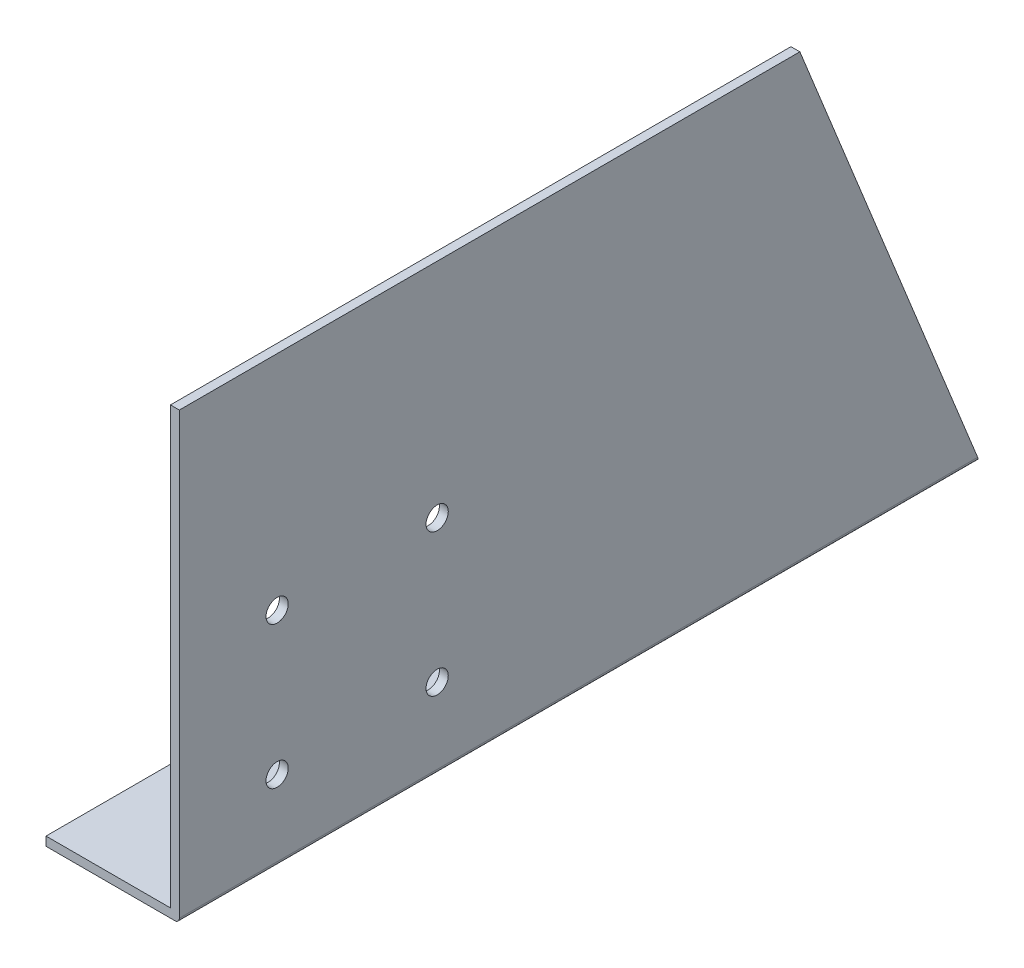
ISO-10303-21;
HEADER;
FILE_DESCRIPTION(('STEP AP214'),'2;1');
FILE_NAME('part.step','',(''),(''),'','','');
FILE_SCHEMA(('AUTOMOTIVE_DESIGN { 1 0 10303 214 1 1 1 1 }'));
ENDSEC;
DATA;
#1=APPLICATION_CONTEXT('core data for automotive mechanical design processes');
#2=APPLICATION_PROTOCOL_DEFINITION('international standard','automotive_design',2000,#1);
#3=PRODUCT_CONTEXT('',#1,'mechanical');
#4=PRODUCT('Part','Part','',(#3));
#5=PRODUCT_RELATED_PRODUCT_CATEGORY('part','',(#4));
#6=PRODUCT_DEFINITION_FORMATION('','',#4);
#7=PRODUCT_DEFINITION_CONTEXT('part definition',#1,'design');
#8=PRODUCT_DEFINITION('design','',#6,#7);
#9=PRODUCT_DEFINITION_SHAPE('','',#8);
#10=(LENGTH_UNIT() NAMED_UNIT(*) SI_UNIT(.MILLI.,.METRE.));
#11=(NAMED_UNIT(*) PLANE_ANGLE_UNIT() SI_UNIT($,.RADIAN.));
#12=(NAMED_UNIT(*) SI_UNIT($,.STERADIAN.) SOLID_ANGLE_UNIT());
#13=UNCERTAINTY_MEASURE_WITH_UNIT(LENGTH_MEASURE(1.E-05),#10,'distance_accuracy_value','');
#14=(GEOMETRIC_REPRESENTATION_CONTEXT(3) GLOBAL_UNCERTAINTY_ASSIGNED_CONTEXT((#13)) GLOBAL_UNIT_ASSIGNED_CONTEXT((#10,
#11,#12)) REPRESENTATION_CONTEXT('',''));
#15=CARTESIAN_POINT('',(0.,0.,0.));
#16=DIRECTION('',(0.,0.,1.));
#17=DIRECTION('',(1.,0.,0.));
#18=AXIS2_PLACEMENT_3D('',#15,#16,#17);
#19=CARTESIAN_POINT('',(0.,2.,180.));
#20=DIRECTION('',(1.,0.,0.));
#21=DIRECTION('',(0.,1.,0.));
#22=AXIS2_PLACEMENT_3D('',#19,#20,#21);
#23=PLANE('',#22);
#24=DIRECTION('',(0.,0.,-1.));
#25=VECTOR('',#24,1.);
#26=CARTESIAN_POINT('',(0.,2.,180.));
#27=LINE('',#26,#25);
#28=CARTESIAN_POINT('',(0.,2.,180.));
#29=VERTEX_POINT('',#28);
#30=CARTESIAN_POINT('',(0.,2.,0.808052451670286));
#31=VERTEX_POINT('',#30);
#32=EDGE_CURVE('E169',#29,#31,#27,.T.);
#33=ORIENTED_EDGE('',*,*,#32,.T.);
#34=DIRECTION('',(0.,-0.92718385456679,-0.374606593415907));
#35=VECTOR('',#34,1.);
#36=CARTESIAN_POINT('',(0.,64.2385931416476,25.9540763399796));
#37=LINE('',#36,#35);
#38=CARTESIAN_POINT('',(0.,0.,0.));
#39=VERTEX_POINT('',#38);
#40=EDGE_CURVE('E139',#31,#39,#37,.T.);
#41=ORIENTED_EDGE('',*,*,#40,.T.);
#42=DIRECTION('',(0.,0.,-1.));
#43=VECTOR('',#42,1.);
#44=CARTESIAN_POINT('',(0.,0.,180.));
#45=LINE('',#44,#43);
#46=CARTESIAN_POINT('',(0.,0.,180.));
#47=VERTEX_POINT('',#46);
#48=EDGE_CURVE('E123',#47,#39,#45,.T.);
#49=ORIENTED_EDGE('',*,*,#48,.F.);
#50=DIRECTION('',(0.,-1.,0.));
#51=VECTOR('',#50,1.);
#52=CARTESIAN_POINT('',(0.,2.,180.));
#53=LINE('',#52,#51);
#54=EDGE_CURVE('E159',#29,#47,#53,.T.);
#55=ORIENTED_EDGE('',*,*,#54,.F.);
#56=EDGE_LOOP('',(#33,#41,#49,#55));
#57=FACE_BOUND('',#56,.T.);
#58=ADVANCED_FACE('F39',(#57),#23,.F.);
#59=CARTESIAN_POINT('',(0.,0.,180.));
#60=DIRECTION('',(0.,1.,0.));
#61=DIRECTION('',(0.,0.,1.));
#62=AXIS2_PLACEMENT_3D('',#59,#60,#61);
#63=PLANE('',#62);
#64=DIRECTION('',(1.,0.,0.));
#65=VECTOR('',#64,1.);
#66=CARTESIAN_POINT('',(0.,0.,0.));
#67=LINE('',#66,#65);
#68=CARTESIAN_POINT('',(29.,0.,0.));
#69=VERTEX_POINT('',#68);
#70=EDGE_CURVE('E151',#39,#69,#67,.T.);
#71=ORIENTED_EDGE('',*,*,#70,.T.);
#72=DIRECTION('',(0.,0.,-1.));
#73=VECTOR('',#72,1.);
#74=CARTESIAN_POINT('',(29.,0.,180.));
#75=LINE('',#74,#73);
#76=CARTESIAN_POINT('',(29.,0.,180.));
#77=VERTEX_POINT('',#76);
#78=EDGE_CURVE('E48',#69,#77,#75,.F.);
#79=ORIENTED_EDGE('',*,*,#78,.T.);
#80=DIRECTION('',(1.,0.,0.));
#81=VECTOR('',#80,1.);
#82=CARTESIAN_POINT('',(0.,0.,180.));
#83=LINE('',#82,#81);
#84=EDGE_CURVE('E163',#47,#77,#83,.T.);
#85=ORIENTED_EDGE('',*,*,#84,.F.);
#86=ORIENTED_EDGE('',*,*,#48,.T.);
#87=EDGE_LOOP('',(#71,#79,#85,#86));
#88=FACE_BOUND('',#87,.T.);
#89=ADVANCED_FACE('F206',(#88),#63,.F.);
#90=CARTESIAN_POINT('',(30.,0.,180.));
#91=DIRECTION('',(-1.,0.,0.));
#92=DIRECTION('',(0.,0.,1.));
#93=AXIS2_PLACEMENT_3D('',#90,#91,#92);
#94=PLANE('',#93);
#95=CARTESIAN_POINT('',(30.,50.,122.));
#96=DIRECTION('',(1.,0.,0.));
#97=DIRECTION('',(0.,0.,-1.));
#98=AXIS2_PLACEMENT_3D('',#95,#96,#97);
#99=CIRCLE('',#98,2.5);
#100=CARTESIAN_POINT('',(30.,50.,119.5));
#101=VERTEX_POINT('',#100);
#102=EDGE_CURVE('E118',#101,#101,#99,.T.);
#103=ORIENTED_EDGE('',*,*,#102,.F.);
#104=EDGE_LOOP('',(#103));
#105=FACE_BOUND('',#104,.T.);
#106=CARTESIAN_POINT('',(30.,18.,122.));
#107=DIRECTION('',(1.,0.,0.));
#108=DIRECTION('',(0.,0.,-1.));
#109=AXIS2_PLACEMENT_3D('',#106,#107,#108);
#110=CIRCLE('',#109,2.5);
#111=CARTESIAN_POINT('',(30.,18.,119.5));
#112=VERTEX_POINT('',#111);
#113=EDGE_CURVE('E323',#112,#112,#110,.T.);
#114=ORIENTED_EDGE('',*,*,#113,.F.);
#115=EDGE_LOOP('',(#114));
#116=FACE_BOUND('',#115,.T.);
#117=CARTESIAN_POINT('',(30.,18.,158.));
#118=DIRECTION('',(1.,0.,0.));
#119=DIRECTION('',(0.,0.,1.));
#120=AXIS2_PLACEMENT_3D('',#117,#118,#119);
#121=CIRCLE('',#120,2.5);
#122=CARTESIAN_POINT('',(30.,18.,155.5));
#123=VERTEX_POINT('',#122);
#124=EDGE_CURVE('E334',#123,#123,#121,.T.);
#125=ORIENTED_EDGE('',*,*,#124,.F.);
#126=EDGE_LOOP('',(#125));
#127=FACE_BOUND('',#126,.T.);
#128=CARTESIAN_POINT('',(30.,50.,158.));
#129=DIRECTION('',(1.,0.,0.));
#130=DIRECTION('',(0.,0.,1.));
#131=AXIS2_PLACEMENT_3D('',#128,#129,#130);
#132=CIRCLE('',#131,2.5);
#133=CARTESIAN_POINT('',(30.,50.,155.5));
#134=VERTEX_POINT('',#133);
#135=EDGE_CURVE('E341',#134,#134,#132,.T.);
#136=ORIENTED_EDGE('',*,*,#135,.F.);
#137=EDGE_LOOP('',(#136));
#138=FACE_BOUND('',#137,.T.);
#139=DIRECTION('',(0.,1.,0.));
#140=VECTOR('',#139,1.);
#141=CARTESIAN_POINT('',(30.,0.,180.));
#142=LINE('',#141,#140);
#143=CARTESIAN_POINT('',(30.,1.,180.));
#144=VERTEX_POINT('',#143);
#145=CARTESIAN_POINT('',(30.,100.,180.));
#146=VERTEX_POINT('',#145);
#147=EDGE_CURVE('E195',#144,#146,#142,.T.);
#148=ORIENTED_EDGE('',*,*,#147,.F.);
#149=DIRECTION('',(0.,0.,-1.));
#150=VECTOR('',#149,1.);
#151=CARTESIAN_POINT('',(30.,1.,180.));
#152=LINE('',#151,#150);
#153=CARTESIAN_POINT('',(30.,1.,0.404026225835151));
#154=VERTEX_POINT('',#153);
#155=EDGE_CURVE('E116',#144,#154,#152,.T.);
#156=ORIENTED_EDGE('',*,*,#155,.T.);
#157=DIRECTION('',(0.,-0.92718385456679,-0.374606593415906));
#158=VECTOR('',#157,1.);
#159=CARTESIAN_POINT('',(30.,100.,40.402622583515));
#160=LINE('',#159,#158);
#161=CARTESIAN_POINT('',(30.,100.,40.402622583515));
#162=VERTEX_POINT('',#161);
#163=EDGE_CURVE('E98',#162,#154,#160,.T.);
#164=ORIENTED_EDGE('',*,*,#163,.F.);
#165=DIRECTION('',(0.,0.,-1.));
#166=VECTOR('',#165,1.);
#167=CARTESIAN_POINT('',(30.,100.,180.));
#168=LINE('',#167,#166);
#169=EDGE_CURVE('E113',#146,#162,#168,.T.);
#170=ORIENTED_EDGE('',*,*,#169,.F.);
#171=EDGE_LOOP('',(#148,#156,#164,#170));
#172=FACE_BOUND('',#171,.T.);
#173=ADVANCED_FACE('F112',(#105,#116,#127,#138,#172),#94,.F.);
#174=CARTESIAN_POINT('',(30.,100.,180.));
#175=DIRECTION('',(0.,-1.,0.));
#176=DIRECTION('',(1.,0.,0.));
#177=AXIS2_PLACEMENT_3D('',#174,#175,#176);
#178=PLANE('',#177);
#179=ORIENTED_EDGE('',*,*,#169,.T.);
#180=DIRECTION('',(1.,0.,0.));
#181=VECTOR('',#180,1.);
#182=CARTESIAN_POINT('',(-150.,100.,40.402622583515));
#183=LINE('',#182,#181);
#184=CARTESIAN_POINT('',(27.9999999999999,100.,40.402622583515));
#185=VERTEX_POINT('',#184);
#186=EDGE_CURVE('E95',#185,#162,#183,.T.);
#187=ORIENTED_EDGE('',*,*,#186,.F.);
#188=DIRECTION('',(0.,0.,-1.));
#189=VECTOR('',#188,1.);
#190=CARTESIAN_POINT('',(28.,100.,180.));
#191=LINE('',#190,#189);
#192=CARTESIAN_POINT('',(28.,100.,180.));
#193=VERTEX_POINT('',#192);
#194=EDGE_CURVE('E124',#193,#185,#191,.T.);
#195=ORIENTED_EDGE('',*,*,#194,.F.);
#196=DIRECTION('',(-1.,0.,0.));
#197=VECTOR('',#196,1.);
#198=CARTESIAN_POINT('',(30.,100.,180.));
#199=LINE('',#198,#197);
#200=EDGE_CURVE('E121',#146,#193,#199,.T.);
#201=ORIENTED_EDGE('',*,*,#200,.F.);
#202=EDGE_LOOP('',(#179,#187,#195,#201));
#203=FACE_BOUND('',#202,.T.);
#204=ADVANCED_FACE('F120',(#203),#178,.F.);
#205=CARTESIAN_POINT('',(28.,100.,180.));
#206=DIRECTION('',(1.,0.,0.));
#207=DIRECTION('',(0.,1.,0.));
#208=AXIS2_PLACEMENT_3D('',#205,#206,#207);
#209=PLANE('',#208);
#210=CARTESIAN_POINT('',(28.,50.,122.));
#211=DIRECTION('',(1.,0.,0.));
#212=DIRECTION('',(0.,1.,0.));
#213=AXIS2_PLACEMENT_3D('',#210,#211,#212);
#214=CIRCLE('',#213,2.5);
#215=CARTESIAN_POINT('',(28.,50.,119.5));
#216=VERTEX_POINT('',#215);
#217=EDGE_CURVE('E147',#216,#216,#214,.T.);
#218=ORIENTED_EDGE('',*,*,#217,.T.);
#219=EDGE_LOOP('',(#218));
#220=FACE_BOUND('',#219,.T.);
#221=CARTESIAN_POINT('',(28.,18.,122.));
#222=DIRECTION('',(1.,0.,0.));
#223=DIRECTION('',(0.,1.,0.));
#224=AXIS2_PLACEMENT_3D('',#221,#222,#223);
#225=CIRCLE('',#224,2.5);
#226=CARTESIAN_POINT('',(28.,18.,119.5));
#227=VERTEX_POINT('',#226);
#228=EDGE_CURVE('E143',#227,#227,#225,.T.);
#229=ORIENTED_EDGE('',*,*,#228,.T.);
#230=EDGE_LOOP('',(#229));
#231=FACE_BOUND('',#230,.T.);
#232=CARTESIAN_POINT('',(28.,18.,158.));
#233=DIRECTION('',(1.,0.,0.));
#234=DIRECTION('',(0.,1.,0.));
#235=AXIS2_PLACEMENT_3D('',#232,#233,#234);
#236=CIRCLE('',#235,2.5);
#237=CARTESIAN_POINT('',(28.,18.,155.5));
#238=VERTEX_POINT('',#237);
#239=EDGE_CURVE('E138',#238,#238,#236,.T.);
#240=ORIENTED_EDGE('',*,*,#239,.T.);
#241=EDGE_LOOP('',(#240));
#242=FACE_BOUND('',#241,.T.);
#243=CARTESIAN_POINT('',(28.,50.,158.));
#244=DIRECTION('',(1.,0.,0.));
#245=DIRECTION('',(0.,1.,0.));
#246=AXIS2_PLACEMENT_3D('',#243,#244,#245);
#247=CIRCLE('',#246,2.5);
#248=CARTESIAN_POINT('',(28.,50.,155.5));
#249=VERTEX_POINT('',#248);
#250=EDGE_CURVE('E134',#249,#249,#247,.T.);
#251=ORIENTED_EDGE('',*,*,#250,.T.);
#252=EDGE_LOOP('',(#251));
#253=FACE_BOUND('',#252,.T.);
#254=ORIENTED_EDGE('',*,*,#194,.T.);
#255=DIRECTION('',(0.,-0.92718385456679,-0.374606593415907));
#256=VECTOR('',#255,1.);
#257=CARTESIAN_POINT('',(28.,148.486243358242,59.9923364924701));
#258=LINE('',#257,#256);
#259=CARTESIAN_POINT('',(28.,2.,0.808052451670288));
#260=VERTEX_POINT('',#259);
#261=EDGE_CURVE('E100',#185,#260,#258,.T.);
#262=ORIENTED_EDGE('',*,*,#261,.T.);
#263=DIRECTION('',(0.,0.,-1.));
#264=VECTOR('',#263,1.);
#265=CARTESIAN_POINT('',(28.,2.,180.));
#266=LINE('',#265,#264);
#267=CARTESIAN_POINT('',(28.,2.,180.));
#268=VERTEX_POINT('',#267);
#269=EDGE_CURVE('E130',#268,#260,#266,.T.);
#270=ORIENTED_EDGE('',*,*,#269,.F.);
#271=DIRECTION('',(0.,-1.,0.));
#272=VECTOR('',#271,1.);
#273=CARTESIAN_POINT('',(28.,100.,180.));
#274=LINE('',#273,#272);
#275=EDGE_CURVE('E183',#193,#268,#274,.T.);
#276=ORIENTED_EDGE('',*,*,#275,.F.);
#277=EDGE_LOOP('',(#254,#262,#270,#276));
#278=FACE_BOUND('',#277,.T.);
#279=ADVANCED_FACE('F182',(#220,#231,#242,#253,#278),#209,.F.);
#280=CARTESIAN_POINT('',(28.,2.,180.));
#281=DIRECTION('',(0.,-1.,0.));
#282=DIRECTION('',(1.,0.,0.));
#283=AXIS2_PLACEMENT_3D('',#280,#281,#282);
#284=PLANE('',#283);
#285=ORIENTED_EDGE('',*,*,#269,.T.);
#286=DIRECTION('',(-1.,0.,0.));
#287=VECTOR('',#286,1.);
#288=CARTESIAN_POINT('',(28.,2.,0.808052451670288));
#289=LINE('',#288,#287);
#290=EDGE_CURVE('E106',#260,#31,#289,.T.);
#291=ORIENTED_EDGE('',*,*,#290,.T.);
#292=ORIENTED_EDGE('',*,*,#32,.F.);
#293=DIRECTION('',(-1.,0.,0.));
#294=VECTOR('',#293,1.);
#295=CARTESIAN_POINT('',(28.,2.,180.));
#296=LINE('',#295,#294);
#297=EDGE_CURVE('E167',#268,#29,#296,.T.);
#298=ORIENTED_EDGE('',*,*,#297,.F.);
#299=EDGE_LOOP('',(#285,#291,#292,#298));
#300=FACE_BOUND('',#299,.T.);
#301=ADVANCED_FACE('F178',(#300),#284,.F.);
#302=CARTESIAN_POINT('',(0.,0.,180.));
#303=DIRECTION('',(0.,0.,1.));
#304=DIRECTION('',(1.,0.,0.));
#305=AXIS2_PLACEMENT_3D('',#302,#303,#304);
#306=PLANE('',#305);
#307=ORIENTED_EDGE('',*,*,#84,.T.);
#308=CARTESIAN_POINT('',(29.,1.,180.));
#309=DIRECTION('',(0.,0.,1.));
#310=DIRECTION('',(1.,0.,0.));
#311=AXIS2_PLACEMENT_3D('',#308,#309,#310);
#312=CIRCLE('',#311,1.);
#313=EDGE_CURVE('E11',#77,#144,#312,.T.);
#314=ORIENTED_EDGE('',*,*,#313,.T.);
#315=ORIENTED_EDGE('',*,*,#147,.T.);
#316=ORIENTED_EDGE('',*,*,#200,.T.);
#317=ORIENTED_EDGE('',*,*,#275,.T.);
#318=ORIENTED_EDGE('',*,*,#297,.T.);
#319=ORIENTED_EDGE('',*,*,#54,.T.);
#320=EDGE_LOOP('',(#307,#314,#315,#316,#317,#318,#319));
#321=FACE_BOUND('',#320,.T.);
#322=ADVANCED_FACE('F202',(#321),#306,.T.);
#323=CARTESIAN_POINT('',(-150.,100.,40.402622583515));
#324=DIRECTION('',(0.,-0.374606593415906,0.92718385456679));
#325=DIRECTION('',(0.,-0.92718385456679,-0.374606593415906));
#326=AXIS2_PLACEMENT_3D('',#323,#324,#325);
#327=PLANE('',#326);
#328=ORIENTED_EDGE('',*,*,#163,.T.);
#329=CARTESIAN_POINT('',(29.,1.,0.40402622583513));
#330=DIRECTION('',(0.,-0.374606593415906,0.92718385456679));
#331=DIRECTION('',(0.,-0.92718385456679,-0.374606593415906));
#332=AXIS2_PLACEMENT_3D('',#329,#330,#331);
#333=ELLIPSE('',#332,1.07853474267758,1.);
#334=EDGE_CURVE('E62',#154,#69,#333,.F.);
#335=ORIENTED_EDGE('',*,*,#334,.T.);
#336=ORIENTED_EDGE('',*,*,#70,.F.);
#337=ORIENTED_EDGE('',*,*,#40,.F.);
#338=ORIENTED_EDGE('',*,*,#290,.F.);
#339=ORIENTED_EDGE('',*,*,#261,.F.);
#340=ORIENTED_EDGE('',*,*,#186,.T.);
#341=EDGE_LOOP('',(#328,#335,#336,#337,#338,#339,#340));
#342=FACE_BOUND('',#341,.T.);
#343=ADVANCED_FACE('F97',(#342),#327,.F.);
#344=CARTESIAN_POINT('',(-150.,50.,158.));
#345=DIRECTION('',(1.,0.,0.));
#346=DIRECTION('',(0.,0.,-1.));
#347=AXIS2_PLACEMENT_3D('',#344,#345,#346);
#348=CYLINDRICAL_SURFACE('',#347,2.5);
#349=CARTESIAN_POINT('',(30.,50.,155.5));
#350=CARTESIAN_POINT('',(29.9791666666666,50.,155.5));
#351=CARTESIAN_POINT('',(29.9583333333333,50.,155.5));
#352=CARTESIAN_POINT('',(29.9166666666666,50.,155.5));
#353=CARTESIAN_POINT('',(29.8958333333333,50.,155.5));
#354=CARTESIAN_POINT('',(29.8541666666666,50.,155.5));
#355=CARTESIAN_POINT('',(29.8333333333333,50.,155.5));
#356=CARTESIAN_POINT('',(29.7916666666666,50.,155.5));
#357=CARTESIAN_POINT('',(29.7708333333333,50.,155.5));
#358=CARTESIAN_POINT('',(29.7291666666666,50.,155.5));
#359=CARTESIAN_POINT('',(29.7083333333333,50.,155.5));
#360=CARTESIAN_POINT('',(29.6666666666666,50.,155.5));
#361=CARTESIAN_POINT('',(29.6458333333333,50.,155.5));
#362=CARTESIAN_POINT('',(29.6041666666666,50.,155.5));
#363=CARTESIAN_POINT('',(29.5833333333333,50.,155.5));
#364=CARTESIAN_POINT('',(29.5416666666666,50.,155.5));
#365=CARTESIAN_POINT('',(29.5208333333333,50.,155.5));
#366=CARTESIAN_POINT('',(29.4791666666666,50.,155.5));
#367=CARTESIAN_POINT('',(29.4583333333333,50.,155.5));
#368=CARTESIAN_POINT('',(29.4166666666666,50.,155.5));
#369=CARTESIAN_POINT('',(29.3958333333333,50.,155.5));
#370=CARTESIAN_POINT('',(29.3541666666666,50.,155.5));
#371=CARTESIAN_POINT('',(29.3333333333333,50.,155.5));
#372=CARTESIAN_POINT('',(29.2916666666666,50.,155.5));
#373=CARTESIAN_POINT('',(29.2708333333333,50.,155.5));
#374=CARTESIAN_POINT('',(29.2291666666666,50.,155.5));
#375=CARTESIAN_POINT('',(29.2083333333333,50.,155.5));
#376=CARTESIAN_POINT('',(29.1666666666666,50.,155.5));
#377=CARTESIAN_POINT('',(29.1458333333333,50.,155.5));
#378=CARTESIAN_POINT('',(29.1041666666666,50.,155.5));
#379=CARTESIAN_POINT('',(29.0833333333333,50.,155.5));
#380=CARTESIAN_POINT('',(29.0416666666666,50.,155.5));
#381=CARTESIAN_POINT('',(29.0208333333333,50.,155.5));
#382=CARTESIAN_POINT('',(28.9791666666666,50.,155.5));
#383=CARTESIAN_POINT('',(28.9583333333333,50.,155.5));
#384=CARTESIAN_POINT('',(28.9166666666666,50.,155.5));
#385=CARTESIAN_POINT('',(28.8958333333333,50.,155.5));
#386=CARTESIAN_POINT('',(28.8541666666666,50.,155.5));
#387=CARTESIAN_POINT('',(28.8333333333333,50.,155.5));
#388=CARTESIAN_POINT('',(28.7916666666666,50.,155.5));
#389=CARTESIAN_POINT('',(28.7708333333333,50.,155.5));
#390=CARTESIAN_POINT('',(28.7291666666666,50.,155.5));
#391=CARTESIAN_POINT('',(28.7083333333333,50.,155.5));
#392=CARTESIAN_POINT('',(28.6666666666666,50.,155.5));
#393=CARTESIAN_POINT('',(28.6458333333333,50.,155.5));
#394=CARTESIAN_POINT('',(28.6041666666666,50.,155.5));
#395=CARTESIAN_POINT('',(28.5833333333333,50.,155.5));
#396=CARTESIAN_POINT('',(28.5416666666666,50.,155.5));
#397=CARTESIAN_POINT('',(28.5208333333333,50.,155.5));
#398=CARTESIAN_POINT('',(28.4791666666666,50.,155.5));
#399=CARTESIAN_POINT('',(28.4583333333333,50.,155.5));
#400=CARTESIAN_POINT('',(28.4166666666666,50.,155.5));
#401=CARTESIAN_POINT('',(28.3958333333333,50.,155.5));
#402=CARTESIAN_POINT('',(28.3541666666666,50.,155.5));
#403=CARTESIAN_POINT('',(28.3333333333333,50.,155.5));
#404=CARTESIAN_POINT('',(28.2916666666666,50.,155.5));
#405=CARTESIAN_POINT('',(28.2708333333333,50.,155.5));
#406=CARTESIAN_POINT('',(28.2291666666666,50.,155.5));
#407=CARTESIAN_POINT('',(28.2083333333333,50.,155.5));
#408=CARTESIAN_POINT('',(28.1666666666666,50.,155.5));
#409=CARTESIAN_POINT('',(28.1458333333333,50.,155.5));
#410=CARTESIAN_POINT('',(28.1041666666666,50.,155.5));
#411=CARTESIAN_POINT('',(28.0833333333333,50.,155.5));
#412=CARTESIAN_POINT('',(28.0416666666666,50.,155.5));
#413=CARTESIAN_POINT('',(28.0208333333333,50.,155.5));
#414=CARTESIAN_POINT('',(28.,50.,155.5));
#415=B_SPLINE_CURVE_WITH_KNOTS('',3,(#349,#350,#351,#352,#353,#354,#355,#356,#357,#358,#359,
#360,#361,#362,#363,#364,#365,#366,#367,#368,#369,#370,#371,#372,#373,#374,#375,#376,#377,#378,
#379,#380,#381,#382,#383,#384,#385,#386,#387,#388,#389,#390,#391,#392,#393,#394,#395,#396,#397,
#398,#399,#400,#401,#402,#403,#404,#405,#406,#407,#408,#409,#410,#411,#412,#413,#414),
.UNSPECIFIED.,.F.,.F.,(4,2,2,2,2,2,2,2,2,2,2,2,2,2,2,2,2,2,2,2,2,2,2,2,2,2,2,2,2,2,2,2,4),(0.,
0.0624999999999931,0.124999999999986,0.187500000000007,0.25,0.312499999999993,0.375000000000014,
0.437500000000007,0.5,0.562499999999994,0.624999999999987,0.687500000000008,0.750000000000001,
0.812499999999994,0.875000000000015,0.937500000000008,1.,1.06249999999999,1.12499999999999,
1.18750000000001,1.25,1.31249999999999,1.37500000000002,1.43750000000001,1.5,1.56249999999999,
1.62499999999999,1.68750000000001,1.75,1.81249999999999,1.87500000000002,1.93750000000001,2.),.UNSPECIFIED.);
#416=EDGE_CURVE('BSEAM234',#134,#249,#415,.T.);
#417=ORIENTED_EDGE('',*,*,#135,.T.);
#418=ORIENTED_EDGE('',*,*,#250,.F.);
#419=ORIENTED_EDGE('',*,*,#416,.T.);
#420=ORIENTED_EDGE('',*,*,#416,.F.);
#421=EDGE_LOOP('',(#417,#419,#418,#420));
#422=FACE_BOUND('',#421,.T.);
#423=ADVANCED_FACE('F234',(#422),#348,.F.);
#424=CARTESIAN_POINT('',(-150.,18.,158.));
#425=DIRECTION('',(1.,0.,0.));
#426=DIRECTION('',(0.,0.,-1.));
#427=AXIS2_PLACEMENT_3D('',#424,#425,#426);
#428=CYLINDRICAL_SURFACE('',#427,2.5);
#429=CARTESIAN_POINT('',(30.,18.,155.5));
#430=CARTESIAN_POINT('',(29.9791666666666,18.,155.5));
#431=CARTESIAN_POINT('',(29.9583333333333,18.,155.5));
#432=CARTESIAN_POINT('',(29.9166666666666,18.,155.5));
#433=CARTESIAN_POINT('',(29.8958333333333,18.,155.5));
#434=CARTESIAN_POINT('',(29.8541666666666,18.,155.5));
#435=CARTESIAN_POINT('',(29.8333333333333,18.,155.5));
#436=CARTESIAN_POINT('',(29.7916666666666,18.,155.5));
#437=CARTESIAN_POINT('',(29.7708333333333,18.,155.5));
#438=CARTESIAN_POINT('',(29.7291666666666,18.,155.5));
#439=CARTESIAN_POINT('',(29.7083333333333,18.,155.5));
#440=CARTESIAN_POINT('',(29.6666666666666,18.,155.5));
#441=CARTESIAN_POINT('',(29.6458333333333,18.,155.5));
#442=CARTESIAN_POINT('',(29.6041666666666,18.,155.5));
#443=CARTESIAN_POINT('',(29.5833333333333,18.,155.5));
#444=CARTESIAN_POINT('',(29.5416666666666,18.,155.5));
#445=CARTESIAN_POINT('',(29.5208333333333,18.,155.5));
#446=CARTESIAN_POINT('',(29.4791666666666,18.,155.5));
#447=CARTESIAN_POINT('',(29.4583333333333,18.,155.5));
#448=CARTESIAN_POINT('',(29.4166666666666,18.,155.5));
#449=CARTESIAN_POINT('',(29.3958333333333,18.,155.5));
#450=CARTESIAN_POINT('',(29.3541666666666,18.,155.5));
#451=CARTESIAN_POINT('',(29.3333333333333,18.,155.5));
#452=CARTESIAN_POINT('',(29.2916666666666,18.,155.5));
#453=CARTESIAN_POINT('',(29.2708333333333,18.,155.5));
#454=CARTESIAN_POINT('',(29.2291666666666,18.,155.5));
#455=CARTESIAN_POINT('',(29.2083333333333,18.,155.5));
#456=CARTESIAN_POINT('',(29.1666666666666,18.,155.5));
#457=CARTESIAN_POINT('',(29.1458333333333,18.,155.5));
#458=CARTESIAN_POINT('',(29.1041666666666,18.,155.5));
#459=CARTESIAN_POINT('',(29.0833333333333,18.,155.5));
#460=CARTESIAN_POINT('',(29.0416666666666,18.,155.5));
#461=CARTESIAN_POINT('',(29.0208333333333,18.,155.5));
#462=CARTESIAN_POINT('',(28.9791666666666,18.,155.5));
#463=CARTESIAN_POINT('',(28.9583333333333,18.,155.5));
#464=CARTESIAN_POINT('',(28.9166666666666,18.,155.5));
#465=CARTESIAN_POINT('',(28.8958333333333,18.,155.5));
#466=CARTESIAN_POINT('',(28.8541666666666,18.,155.5));
#467=CARTESIAN_POINT('',(28.8333333333333,18.,155.5));
#468=CARTESIAN_POINT('',(28.7916666666666,18.,155.5));
#469=CARTESIAN_POINT('',(28.7708333333333,18.,155.5));
#470=CARTESIAN_POINT('',(28.7291666666666,18.,155.5));
#471=CARTESIAN_POINT('',(28.7083333333333,18.,155.5));
#472=CARTESIAN_POINT('',(28.6666666666666,18.,155.5));
#473=CARTESIAN_POINT('',(28.6458333333333,18.,155.5));
#474=CARTESIAN_POINT('',(28.6041666666666,18.,155.5));
#475=CARTESIAN_POINT('',(28.5833333333333,18.,155.5));
#476=CARTESIAN_POINT('',(28.5416666666666,18.,155.5));
#477=CARTESIAN_POINT('',(28.5208333333333,18.,155.5));
#478=CARTESIAN_POINT('',(28.4791666666666,18.,155.5));
#479=CARTESIAN_POINT('',(28.4583333333333,18.,155.5));
#480=CARTESIAN_POINT('',(28.4166666666666,18.,155.5));
#481=CARTESIAN_POINT('',(28.3958333333333,18.,155.5));
#482=CARTESIAN_POINT('',(28.3541666666666,18.,155.5));
#483=CARTESIAN_POINT('',(28.3333333333333,18.,155.5));
#484=CARTESIAN_POINT('',(28.2916666666666,18.,155.5));
#485=CARTESIAN_POINT('',(28.2708333333333,18.,155.5));
#486=CARTESIAN_POINT('',(28.2291666666666,18.,155.5));
#487=CARTESIAN_POINT('',(28.2083333333333,18.,155.5));
#488=CARTESIAN_POINT('',(28.1666666666666,18.,155.5));
#489=CARTESIAN_POINT('',(28.1458333333333,18.,155.5));
#490=CARTESIAN_POINT('',(28.1041666666666,18.,155.5));
#491=CARTESIAN_POINT('',(28.0833333333333,18.,155.5));
#492=CARTESIAN_POINT('',(28.0416666666666,18.,155.5));
#493=CARTESIAN_POINT('',(28.0208333333333,18.,155.5));
#494=CARTESIAN_POINT('',(28.,18.,155.5));
#495=B_SPLINE_CURVE_WITH_KNOTS('',3,(#429,#430,#431,#432,#433,#434,#435,#436,#437,#438,#439,
#440,#441,#442,#443,#444,#445,#446,#447,#448,#449,#450,#451,#452,#453,#454,#455,#456,#457,#458,
#459,#460,#461,#462,#463,#464,#465,#466,#467,#468,#469,#470,#471,#472,#473,#474,#475,#476,#477,
#478,#479,#480,#481,#482,#483,#484,#485,#486,#487,#488,#489,#490,#491,#492,#493,#494),
.UNSPECIFIED.,.F.,.F.,(4,2,2,2,2,2,2,2,2,2,2,2,2,2,2,2,2,2,2,2,2,2,2,2,2,2,2,2,2,2,2,2,4),(0.,
0.0624999999999931,0.124999999999986,0.187500000000007,0.25,0.312499999999993,0.375000000000014,
0.437500000000007,0.5,0.562499999999994,0.624999999999987,0.687500000000008,0.750000000000001,
0.812499999999994,0.875000000000015,0.937500000000008,1.,1.06249999999999,1.12499999999999,
1.18750000000001,1.25,1.31249999999999,1.37500000000002,1.43750000000001,1.5,1.56249999999999,
1.62499999999999,1.68750000000001,1.75,1.81249999999999,1.87500000000002,1.93750000000001,2.),.UNSPECIFIED.);
#496=EDGE_CURVE('BSEAM237',#123,#238,#495,.T.);
#497=ORIENTED_EDGE('',*,*,#124,.T.);
#498=ORIENTED_EDGE('',*,*,#239,.F.);
#499=ORIENTED_EDGE('',*,*,#496,.T.);
#500=ORIENTED_EDGE('',*,*,#496,.F.);
#501=EDGE_LOOP('',(#497,#499,#498,#500));
#502=FACE_BOUND('',#501,.T.);
#503=ADVANCED_FACE('F237',(#502),#428,.F.);
#504=CARTESIAN_POINT('',(-150.,18.,122.));
#505=DIRECTION('',(1.,0.,0.));
#506=DIRECTION('',(0.,0.,-1.));
#507=AXIS2_PLACEMENT_3D('',#504,#505,#506);
#508=CYLINDRICAL_SURFACE('',#507,2.5);
#509=CARTESIAN_POINT('',(30.,18.,119.5));
#510=CARTESIAN_POINT('',(29.9791666666666,18.,119.5));
#511=CARTESIAN_POINT('',(29.9583333333333,18.,119.5));
#512=CARTESIAN_POINT('',(29.9166666666666,18.,119.5));
#513=CARTESIAN_POINT('',(29.8958333333333,18.,119.5));
#514=CARTESIAN_POINT('',(29.8541666666666,18.,119.5));
#515=CARTESIAN_POINT('',(29.8333333333333,18.,119.5));
#516=CARTESIAN_POINT('',(29.7916666666666,18.,119.5));
#517=CARTESIAN_POINT('',(29.7708333333333,18.,119.5));
#518=CARTESIAN_POINT('',(29.7291666666666,18.,119.5));
#519=CARTESIAN_POINT('',(29.7083333333333,18.,119.5));
#520=CARTESIAN_POINT('',(29.6666666666666,18.,119.5));
#521=CARTESIAN_POINT('',(29.6458333333333,18.,119.5));
#522=CARTESIAN_POINT('',(29.6041666666666,18.,119.5));
#523=CARTESIAN_POINT('',(29.5833333333333,18.,119.5));
#524=CARTESIAN_POINT('',(29.5416666666666,18.,119.5));
#525=CARTESIAN_POINT('',(29.5208333333333,18.,119.5));
#526=CARTESIAN_POINT('',(29.4791666666666,18.,119.5));
#527=CARTESIAN_POINT('',(29.4583333333333,18.,119.5));
#528=CARTESIAN_POINT('',(29.4166666666666,18.,119.5));
#529=CARTESIAN_POINT('',(29.3958333333333,18.,119.5));
#530=CARTESIAN_POINT('',(29.3541666666666,18.,119.5));
#531=CARTESIAN_POINT('',(29.3333333333333,18.,119.5));
#532=CARTESIAN_POINT('',(29.2916666666666,18.,119.5));
#533=CARTESIAN_POINT('',(29.2708333333333,18.,119.5));
#534=CARTESIAN_POINT('',(29.2291666666666,18.,119.5));
#535=CARTESIAN_POINT('',(29.2083333333333,18.,119.5));
#536=CARTESIAN_POINT('',(29.1666666666666,18.,119.5));
#537=CARTESIAN_POINT('',(29.1458333333333,18.,119.5));
#538=CARTESIAN_POINT('',(29.1041666666666,18.,119.5));
#539=CARTESIAN_POINT('',(29.0833333333333,18.,119.5));
#540=CARTESIAN_POINT('',(29.0416666666666,18.,119.5));
#541=CARTESIAN_POINT('',(29.0208333333333,18.,119.5));
#542=CARTESIAN_POINT('',(28.9791666666666,18.,119.5));
#543=CARTESIAN_POINT('',(28.9583333333333,18.,119.5));
#544=CARTESIAN_POINT('',(28.9166666666666,18.,119.5));
#545=CARTESIAN_POINT('',(28.8958333333333,18.,119.5));
#546=CARTESIAN_POINT('',(28.8541666666666,18.,119.5));
#547=CARTESIAN_POINT('',(28.8333333333333,18.,119.5));
#548=CARTESIAN_POINT('',(28.7916666666666,18.,119.5));
#549=CARTESIAN_POINT('',(28.7708333333333,18.,119.5));
#550=CARTESIAN_POINT('',(28.7291666666666,18.,119.5));
#551=CARTESIAN_POINT('',(28.7083333333333,18.,119.5));
#552=CARTESIAN_POINT('',(28.6666666666666,18.,119.5));
#553=CARTESIAN_POINT('',(28.6458333333333,18.,119.5));
#554=CARTESIAN_POINT('',(28.6041666666666,18.,119.5));
#555=CARTESIAN_POINT('',(28.5833333333333,18.,119.5));
#556=CARTESIAN_POINT('',(28.5416666666666,18.,119.5));
#557=CARTESIAN_POINT('',(28.5208333333333,18.,119.5));
#558=CARTESIAN_POINT('',(28.4791666666666,18.,119.5));
#559=CARTESIAN_POINT('',(28.4583333333333,18.,119.5));
#560=CARTESIAN_POINT('',(28.4166666666666,18.,119.5));
#561=CARTESIAN_POINT('',(28.3958333333333,18.,119.5));
#562=CARTESIAN_POINT('',(28.3541666666666,18.,119.5));
#563=CARTESIAN_POINT('',(28.3333333333333,18.,119.5));
#564=CARTESIAN_POINT('',(28.2916666666666,18.,119.5));
#565=CARTESIAN_POINT('',(28.2708333333333,18.,119.5));
#566=CARTESIAN_POINT('',(28.2291666666666,18.,119.5));
#567=CARTESIAN_POINT('',(28.2083333333333,18.,119.5));
#568=CARTESIAN_POINT('',(28.1666666666666,18.,119.5));
#569=CARTESIAN_POINT('',(28.1458333333333,18.,119.5));
#570=CARTESIAN_POINT('',(28.1041666666666,18.,119.5));
#571=CARTESIAN_POINT('',(28.0833333333333,18.,119.5));
#572=CARTESIAN_POINT('',(28.0416666666666,18.,119.5));
#573=CARTESIAN_POINT('',(28.0208333333333,18.,119.5));
#574=CARTESIAN_POINT('',(28.,18.,119.5));
#575=B_SPLINE_CURVE_WITH_KNOTS('',3,(#509,#510,#511,#512,#513,#514,#515,#516,#517,#518,#519,
#520,#521,#522,#523,#524,#525,#526,#527,#528,#529,#530,#531,#532,#533,#534,#535,#536,#537,#538,
#539,#540,#541,#542,#543,#544,#545,#546,#547,#548,#549,#550,#551,#552,#553,#554,#555,#556,#557,
#558,#559,#560,#561,#562,#563,#564,#565,#566,#567,#568,#569,#570,#571,#572,#573,#574),
.UNSPECIFIED.,.F.,.F.,(4,2,2,2,2,2,2,2,2,2,2,2,2,2,2,2,2,2,2,2,2,2,2,2,2,2,2,2,2,2,2,2,4),(0.,
0.0624999999999931,0.124999999999986,0.187500000000007,0.25,0.312499999999993,0.375000000000014,
0.437500000000007,0.5,0.562499999999994,0.624999999999987,0.687500000000008,0.750000000000001,
0.812499999999994,0.875000000000015,0.937500000000008,1.,1.06249999999999,1.12499999999999,
1.18750000000001,1.25,1.31249999999999,1.37500000000002,1.43750000000001,1.5,1.56249999999999,
1.62499999999999,1.68750000000001,1.75,1.81249999999999,1.87500000000002,1.93750000000001,2.),.UNSPECIFIED.);
#576=EDGE_CURVE('BSEAM214',#112,#227,#575,.T.);
#577=ORIENTED_EDGE('',*,*,#113,.T.);
#578=ORIENTED_EDGE('',*,*,#228,.F.);
#579=ORIENTED_EDGE('',*,*,#576,.T.);
#580=ORIENTED_EDGE('',*,*,#576,.F.);
#581=EDGE_LOOP('',(#577,#579,#578,#580));
#582=FACE_BOUND('',#581,.T.);
#583=ADVANCED_FACE('F214',(#582),#508,.F.);
#584=CARTESIAN_POINT('',(-150.,50.,122.));
#585=DIRECTION('',(1.,0.,0.));
#586=DIRECTION('',(0.,0.,-1.));
#587=AXIS2_PLACEMENT_3D('',#584,#585,#586);
#588=CYLINDRICAL_SURFACE('',#587,2.5);
#589=CARTESIAN_POINT('',(30.,50.,119.5));
#590=CARTESIAN_POINT('',(29.9791666666666,50.,119.5));
#591=CARTESIAN_POINT('',(29.9583333333333,50.,119.5));
#592=CARTESIAN_POINT('',(29.9166666666666,50.,119.5));
#593=CARTESIAN_POINT('',(29.8958333333333,50.,119.5));
#594=CARTESIAN_POINT('',(29.8541666666666,50.,119.5));
#595=CARTESIAN_POINT('',(29.8333333333333,50.,119.5));
#596=CARTESIAN_POINT('',(29.7916666666666,50.,119.5));
#597=CARTESIAN_POINT('',(29.7708333333333,50.,119.5));
#598=CARTESIAN_POINT('',(29.7291666666666,50.,119.5));
#599=CARTESIAN_POINT('',(29.7083333333333,50.,119.5));
#600=CARTESIAN_POINT('',(29.6666666666666,50.,119.5));
#601=CARTESIAN_POINT('',(29.6458333333333,50.,119.5));
#602=CARTESIAN_POINT('',(29.6041666666666,50.,119.5));
#603=CARTESIAN_POINT('',(29.5833333333333,50.,119.5));
#604=CARTESIAN_POINT('',(29.5416666666666,50.,119.5));
#605=CARTESIAN_POINT('',(29.5208333333333,50.,119.5));
#606=CARTESIAN_POINT('',(29.4791666666666,50.,119.5));
#607=CARTESIAN_POINT('',(29.4583333333333,50.,119.5));
#608=CARTESIAN_POINT('',(29.4166666666666,50.,119.5));
#609=CARTESIAN_POINT('',(29.3958333333333,50.,119.5));
#610=CARTESIAN_POINT('',(29.3541666666666,50.,119.5));
#611=CARTESIAN_POINT('',(29.3333333333333,50.,119.5));
#612=CARTESIAN_POINT('',(29.2916666666666,50.,119.5));
#613=CARTESIAN_POINT('',(29.2708333333333,50.,119.5));
#614=CARTESIAN_POINT('',(29.2291666666666,50.,119.5));
#615=CARTESIAN_POINT('',(29.2083333333333,50.,119.5));
#616=CARTESIAN_POINT('',(29.1666666666666,50.,119.5));
#617=CARTESIAN_POINT('',(29.1458333333333,50.,119.5));
#618=CARTESIAN_POINT('',(29.1041666666666,50.,119.5));
#619=CARTESIAN_POINT('',(29.0833333333333,50.,119.5));
#620=CARTESIAN_POINT('',(29.0416666666666,50.,119.5));
#621=CARTESIAN_POINT('',(29.0208333333333,50.,119.5));
#622=CARTESIAN_POINT('',(28.9791666666666,50.,119.5));
#623=CARTESIAN_POINT('',(28.9583333333333,50.,119.5));
#624=CARTESIAN_POINT('',(28.9166666666666,50.,119.5));
#625=CARTESIAN_POINT('',(28.8958333333333,50.,119.5));
#626=CARTESIAN_POINT('',(28.8541666666666,50.,119.5));
#627=CARTESIAN_POINT('',(28.8333333333333,50.,119.5));
#628=CARTESIAN_POINT('',(28.7916666666666,50.,119.5));
#629=CARTESIAN_POINT('',(28.7708333333333,50.,119.5));
#630=CARTESIAN_POINT('',(28.7291666666666,50.,119.5));
#631=CARTESIAN_POINT('',(28.7083333333333,50.,119.5));
#632=CARTESIAN_POINT('',(28.6666666666666,50.,119.5));
#633=CARTESIAN_POINT('',(28.6458333333333,50.,119.5));
#634=CARTESIAN_POINT('',(28.6041666666666,50.,119.5));
#635=CARTESIAN_POINT('',(28.5833333333333,50.,119.5));
#636=CARTESIAN_POINT('',(28.5416666666666,50.,119.5));
#637=CARTESIAN_POINT('',(28.5208333333333,50.,119.5));
#638=CARTESIAN_POINT('',(28.4791666666666,50.,119.5));
#639=CARTESIAN_POINT('',(28.4583333333333,50.,119.5));
#640=CARTESIAN_POINT('',(28.4166666666666,50.,119.5));
#641=CARTESIAN_POINT('',(28.3958333333333,50.,119.5));
#642=CARTESIAN_POINT('',(28.3541666666666,50.,119.5));
#643=CARTESIAN_POINT('',(28.3333333333333,50.,119.5));
#644=CARTESIAN_POINT('',(28.2916666666666,50.,119.5));
#645=CARTESIAN_POINT('',(28.2708333333333,50.,119.5));
#646=CARTESIAN_POINT('',(28.2291666666666,50.,119.5));
#647=CARTESIAN_POINT('',(28.2083333333333,50.,119.5));
#648=CARTESIAN_POINT('',(28.1666666666666,50.,119.5));
#649=CARTESIAN_POINT('',(28.1458333333333,50.,119.5));
#650=CARTESIAN_POINT('',(28.1041666666666,50.,119.5));
#651=CARTESIAN_POINT('',(28.0833333333333,50.,119.5));
#652=CARTESIAN_POINT('',(28.0416666666666,50.,119.5));
#653=CARTESIAN_POINT('',(28.0208333333333,50.,119.5));
#654=CARTESIAN_POINT('',(28.,50.,119.5));
#655=B_SPLINE_CURVE_WITH_KNOTS('',3,(#589,#590,#591,#592,#593,#594,#595,#596,#597,#598,#599,
#600,#601,#602,#603,#604,#605,#606,#607,#608,#609,#610,#611,#612,#613,#614,#615,#616,#617,#618,
#619,#620,#621,#622,#623,#624,#625,#626,#627,#628,#629,#630,#631,#632,#633,#634,#635,#636,#637,
#638,#639,#640,#641,#642,#643,#644,#645,#646,#647,#648,#649,#650,#651,#652,#653,#654),
.UNSPECIFIED.,.F.,.F.,(4,2,2,2,2,2,2,2,2,2,2,2,2,2,2,2,2,2,2,2,2,2,2,2,2,2,2,2,2,2,2,2,4),(0.,
0.0624999999999931,0.124999999999986,0.187500000000007,0.25,0.312499999999993,0.375000000000014,
0.437500000000007,0.5,0.562499999999994,0.624999999999987,0.687500000000008,0.750000000000001,
0.812499999999994,0.875000000000015,0.937500000000008,1.,1.06249999999999,1.12499999999999,
1.18750000000001,1.25,1.31249999999999,1.37500000000002,1.43750000000001,1.5,1.56249999999999,
1.62499999999999,1.68750000000001,1.75,1.81249999999999,1.87500000000002,1.93750000000001,2.),.UNSPECIFIED.);
#656=EDGE_CURVE('BSEAM210',#101,#216,#655,.T.);
#657=ORIENTED_EDGE('',*,*,#102,.T.);
#658=ORIENTED_EDGE('',*,*,#217,.F.);
#659=ORIENTED_EDGE('',*,*,#656,.T.);
#660=ORIENTED_EDGE('',*,*,#656,.F.);
#661=EDGE_LOOP('',(#657,#659,#658,#660));
#662=FACE_BOUND('',#661,.T.);
#663=ADVANCED_FACE('F210',(#662),#588,.F.);
#664=CARTESIAN_POINT('',(29.,1.,180.));
#665=DIRECTION('',(0.,0.,-1.));
#666=DIRECTION('',(-1.,0.,0.));
#667=AXIS2_PLACEMENT_3D('',#664,#665,#666);
#668=CYLINDRICAL_SURFACE('',#667,1.);
#669=ORIENTED_EDGE('',*,*,#313,.F.);
#670=ORIENTED_EDGE('',*,*,#78,.F.);
#671=ORIENTED_EDGE('',*,*,#334,.F.);
#672=ORIENTED_EDGE('',*,*,#155,.F.);
#673=EDGE_LOOP('',(#669,#670,#671,#672));
#674=FACE_BOUND('',#673,.T.);
#675=ADVANCED_FACE('F41',(#674),#668,.T.);
#676=CLOSED_SHELL('',(#58,#89,#173,#204,#279,#301,#322,#343,#423,#503,#583,#663,#675));
#677=MANIFOLD_SOLID_BREP('B2',#676);
#678=ADVANCED_BREP_SHAPE_REPRESENTATION('',(#18,#677),#14);
#679=SHAPE_DEFINITION_REPRESENTATION(#9,#678);
ENDSEC;
END-ISO-10303-21;
